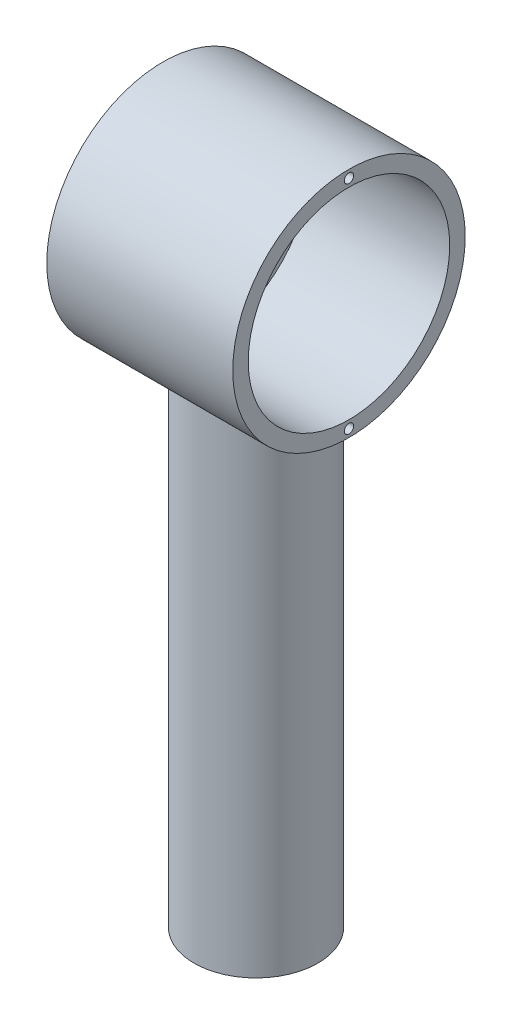
ISO-10303-21;
HEADER;
FILE_DESCRIPTION(('STEP AP214'),'2;1');
FILE_NAME('part.step','',(''),(''),'','','');
FILE_SCHEMA(('AUTOMOTIVE_DESIGN { 1 0 10303 214 1 1 1 1 }'));
ENDSEC;
DATA;
#1=APPLICATION_CONTEXT('core data for automotive mechanical design processes');
#2=APPLICATION_PROTOCOL_DEFINITION('international standard','automotive_design',2000,#1);
#3=PRODUCT_CONTEXT('',#1,'mechanical');
#4=PRODUCT('Part','Part','',(#3));
#5=PRODUCT_RELATED_PRODUCT_CATEGORY('part','',(#4));
#6=PRODUCT_DEFINITION_FORMATION('','',#4);
#7=PRODUCT_DEFINITION_CONTEXT('part definition',#1,'design');
#8=PRODUCT_DEFINITION('design','',#6,#7);
#9=PRODUCT_DEFINITION_SHAPE('','',#8);
#10=(LENGTH_UNIT() NAMED_UNIT(*) SI_UNIT(.MILLI.,.METRE.));
#11=(NAMED_UNIT(*) PLANE_ANGLE_UNIT() SI_UNIT($,.RADIAN.));
#12=(NAMED_UNIT(*) SI_UNIT($,.STERADIAN.) SOLID_ANGLE_UNIT());
#13=UNCERTAINTY_MEASURE_WITH_UNIT(LENGTH_MEASURE(1.E-05),#10,'distance_accuracy_value','');
#14=(GEOMETRIC_REPRESENTATION_CONTEXT(3) GLOBAL_UNCERTAINTY_ASSIGNED_CONTEXT((#13)) GLOBAL_UNIT_ASSIGNED_CONTEXT((#10,
#11,#12)) REPRESENTATION_CONTEXT('',''));
#15=CARTESIAN_POINT('',(0.,0.,0.));
#16=DIRECTION('',(0.,0.,1.));
#17=DIRECTION('',(1.,0.,0.));
#18=AXIS2_PLACEMENT_3D('',#15,#16,#17);
#19=CARTESIAN_POINT('',(30.,39.3347293897193,0.));
#20=DIRECTION('',(-1.,0.,0.));
#21=DIRECTION('',(0.,0.,1.));
#22=AXIS2_PLACEMENT_3D('',#19,#20,#21);
#23=CYLINDRICAL_SURFACE('',#22,37.5);
#24=CARTESIAN_POINT('',(0.,7.61328553859548,-20.));
#25=CARTESIAN_POINT('',(-0.51570182078703,7.6132880699644,-20.0000020694901));
#26=CARTESIAN_POINT('',(-1.03138048086282,7.60066823523603,-19.9800293716016));
#27=CARTESIAN_POINT('',(-2.05864988227541,7.55069636760927,-19.900438433849));
#28=CARTESIAN_POINT('',(-2.57023901293608,7.51333503324412,-19.8408052837619));
#29=CARTESIAN_POINT('',(-3.58588736208425,7.4152585886438,-19.6826321785822));
#30=CARTESIAN_POINT('',(-4.08993349078951,7.35450688776835,-19.5840312579613));
#31=CARTESIAN_POINT('',(-5.08606982289711,7.2119173548362,-19.3492573673804));
#32=CARTESIAN_POINT('',(-5.57816083404603,7.13008095172584,-19.2130869435256));
#33=CARTESIAN_POINT('',(-6.54451950031659,6.94867128669877,-18.9056831081237));
#34=CARTESIAN_POINT('',(-7.01887598033731,6.84920676482473,-18.7346637469901));
#35=CARTESIAN_POINT('',(-7.95042793399519,6.63528396459707,-18.3587310871486));
#36=CARTESIAN_POINT('',(-8.40762317654205,6.52082548443047,-18.1538173322254));
#37=CARTESIAN_POINT('',(-9.30288077314572,6.280113119196,-17.7117378683888));
#38=CARTESIAN_POINT('',(-9.7409430177589,6.15385916666921,-17.4745719750203));
#39=CARTESIAN_POINT('',(-10.5963194801134,5.89274883388715,-16.9695240952738));
#40=CARTESIAN_POINT('',(-11.0136317584403,5.75789165220258,-16.7016392454284));
#41=CARTESIAN_POINT('',(-11.8645739174769,5.46965896243555,-16.1097902433487));
#42=CARTESIAN_POINT('',(-12.2959988155331,5.31574005112918,-15.7829171398827));
#43=CARTESIAN_POINT('',(-13.1302687696288,5.00538236736176,-15.0959577863311));
#44=CARTESIAN_POINT('',(-13.5331236847503,4.84894448725216,-14.7358830932635));
#45=CARTESIAN_POINT('',(-14.3089302194614,4.53718321222723,-13.983797171619));
#46=CARTESIAN_POINT('',(-14.6818598793333,4.38186071053715,-13.5917629081743));
#47=CARTESIAN_POINT('',(-15.3955976257313,4.07610720045685,-12.7776616216099));
#48=CARTESIAN_POINT('',(-15.7364045621611,3.9256763673302,-12.3555935241317));
#49=CARTESIAN_POINT('',(-16.4096071243127,3.62159504628239,-11.4485193546584));
#50=CARTESIAN_POINT('',(-16.7391795739264,3.46863951891845,-10.9611773223788));
#51=CARTESIAN_POINT('',(-17.3557414498559,3.17677022398932,-9.95619250224608));
#52=CARTESIAN_POINT('',(-17.6427280097321,3.03785740183352,-9.43854767799109));
#53=CARTESIAN_POINT('',(-18.1710455089747,2.77814316417008,-8.37643552854965));
#54=CARTESIAN_POINT('',(-18.41240146501,2.65733183222565,-7.83198310803149));
#55=CARTESIAN_POINT('',(-18.8467311540172,2.43738288695592,-6.71989087808538));
#56=CARTESIAN_POINT('',(-19.0397108691608,2.33824259399959,-6.15225394574328));
#57=CARTESIAN_POINT('',(-19.3613843695543,2.17163162893653,-5.04409084493633));
#58=CARTESIAN_POINT('',(-19.4939561926983,2.10227597479069,-4.50497266267378));
#59=CARTESIAN_POINT('',(-19.7140932565086,1.98654763965169,-3.41518253756319));
#60=CARTESIAN_POINT('',(-19.8016606717114,1.9401738482179,-2.86451115428459));
#61=CARTESIAN_POINT('',(-19.9305089797469,1.87178493678521,-1.75660288316389));
#62=CARTESIAN_POINT('',(-19.9718172176824,1.84975542629783,-1.19937007105454));
#63=CARTESIAN_POINT('',(-20.0076218669366,1.83066715768317,-0.0829912230449223));
#64=CARTESIAN_POINT('',(-20.0021216831258,1.83360658330163,0.476154670739197));
#65=CARTESIAN_POINT('',(-19.9472644127489,1.86283417630171,1.53619969533));
#66=CARTESIAN_POINT('',(-19.9022922570022,1.88678776447231,2.03739765283052));
#67=CARTESIAN_POINT('',(-19.7749621587987,1.95430394753898,3.03364583244079));
#68=CARTESIAN_POINT('',(-19.6926072248326,1.99786496446631,3.52869654597525));
#69=CARTESIAN_POINT('',(-19.4914513891179,2.10356816382798,4.50931008296979));
#70=CARTESIAN_POINT('',(-19.3726492483943,2.16571097792434,4.99487258329354));
#71=CARTESIAN_POINT('',(-19.0998645810979,2.30715542449527,5.95344599270102));
#72=CARTESIAN_POINT('',(-18.9458807186661,2.38645770851321,6.42645642441812));
#73=CARTESIAN_POINT('',(-18.6021940192179,2.56151225269992,7.36274655171216));
#74=CARTESIAN_POINT('',(-18.4120876761664,2.65744915384273,7.82584330093237));
#75=CARTESIAN_POINT('',(-17.9990703595971,2.86303540513644,8.73397464778428));
#76=CARTESIAN_POINT('',(-17.7761594997008,2.97268470779299,9.17900930796887));
#77=CARTESIAN_POINT('',(-17.2992035665849,3.20345648806732,10.0490666696836));
#78=CARTESIAN_POINT('',(-17.0451518693495,3.32458140543233,10.4740850868216));
#79=CARTESIAN_POINT('',(-16.5076300698118,3.57587866384264,11.3022971689998));
#80=CARTESIAN_POINT('',(-16.2241573265239,3.70605181675742,11.7054888698094));
#81=CARTESIAN_POINT('',(-15.5985893577811,3.98674568958366,12.5291017597988));
#82=CARTESIAN_POINT('',(-15.2534633423082,4.13797742844741,12.9469820282129));
#83=CARTESIAN_POINT('',(-14.5313798049263,4.44484295747273,13.7525145719855));
#84=CARTESIAN_POINT('',(-14.1544203560153,4.60047701374398,14.1401650146785));
#85=CARTESIAN_POINT('',(-13.3701405977241,4.91262663007434,14.8839378037101));
#86=CARTESIAN_POINT('',(-12.9627935496855,5.06914285172146,15.2400317655331));
#87=CARTESIAN_POINT('',(-12.3307195861961,5.30153569487148,15.7488582454633));
#88=CARTESIAN_POINT('',(-12.116510807287,5.37860595092003,15.9142538119811));
#89=CARTESIAN_POINT('',(-11.681195108966,5.53149327670738,16.2364723560311));
#90=CARTESIAN_POINT('',(-11.460086037774,5.60730994402196,16.3932926166317));
#91=CARTESIAN_POINT('',(-10.7512386458969,5.84397514109671,16.8746465090342));
#92=CARTESIAN_POINT('',(-10.2513083612089,6.00159901702219,17.1830498160679));
#93=CARTESIAN_POINT('',(-9.22309815410546,6.30331720299424,17.7561472395889));
#94=CARTESIAN_POINT('',(-8.69482088095189,6.44741277392444,18.0208454312885));
#95=CARTESIAN_POINT('',(-7.88366626468449,6.64935618490528,18.3830210735658));
#96=CARTESIAN_POINT('',(-7.61021828324999,6.71429172444382,18.497913664606));
#97=CARTESIAN_POINT('',(-7.05750140500056,6.83879429917899,18.715766604051));
#98=CARTESIAN_POINT('',(-6.77823400271512,6.89836269233171,18.8187299725957));
#99=CARTESIAN_POINT('',(-5.93231320321243,7.0680650478359,19.1092351768966));
#100=CARTESIAN_POINT('',(-5.35737558916738,7.16923807530391,19.2784662419717));
#101=CARTESIAN_POINT('',(-4.23790937229369,7.33584327360834,19.553644852043));
#102=CARTESIAN_POINT('',(-3.69469269630252,7.40350754882363,19.6636096891331));
#103=CARTESIAN_POINT('',(-2.59831392694322,7.51172052869058,19.8382645405692));
#104=CARTESIAN_POINT('',(-2.04515244738685,7.55227090100259,19.9029573394163));
#105=CARTESIAN_POINT('',(-0.934456021777517,7.60436975146174,19.985912455731));
#106=CARTESIAN_POINT('',(-0.376925082364807,7.61594224913097,20.0042132273243));
#107=CARTESIAN_POINT('',(0.737521490785031,7.60960405604995,19.9941613677195));
#108=CARTESIAN_POINT('',(1.29443717682133,7.59169610124954,19.9658130658148));
#109=CARTESIAN_POINT('',(2.32861782358089,7.53154939769093,19.8698354015943));
#110=CARTESIAN_POINT('',(2.80663609459942,7.49285872051378,19.807924313161));
#111=CARTESIAN_POINT('',(3.75490327816776,7.39530343572092,19.6502332853426));
#112=CARTESIAN_POINT('',(4.22515302415459,7.33644100713542,19.5544570041705));
#113=CARTESIAN_POINT('',(5.15517852611524,7.20041592332948,19.3301078005834));
#114=CARTESIAN_POINT('',(5.6149510025583,7.12324762206767,19.201524758723));
#115=CARTESIAN_POINT('',(6.52146009102425,6.95292610209488,18.9128757451853));
#116=CARTESIAN_POINT('',(6.9681958338559,6.85977182039513,18.7528076798059));
#117=CARTESIAN_POINT('',(7.86590665438222,6.65563689578103,18.394868382629));
#118=CARTESIAN_POINT('',(8.31620402945305,6.54405241736956,18.1956441409796));
#119=CARTESIAN_POINT('',(9.19863635779434,6.30922572449742,17.7658681503462));
#120=CARTESIAN_POINT('',(9.63076356428131,6.18597860906466,17.5353032131866));
#121=CARTESIAN_POINT('',(10.4751592846687,5.9308834237878,17.0443420482752));
#122=CARTESIAN_POINT('',(10.8874241815632,5.79903379760681,16.7839404160909));
#123=CARTESIAN_POINT('',(11.6906450394737,5.52972993234768,16.234702654998));
#124=CARTESIAN_POINT('',(12.0815992232859,5.39227522750069,15.9458641602208));
#125=CARTESIAN_POINT('',(12.8968327162095,5.09419926730205,15.2964635816017));
#126=CARTESIAN_POINT('',(13.3175400727492,4.93314757086699,14.931603315024));
#127=CARTESIAN_POINT('',(14.1272437684801,4.61166900271007,14.167947195493));
#128=CARTESIAN_POINT('',(14.5162373768361,4.45124218592611,13.7691484261636));
#129=CARTESIAN_POINT('',(15.260632807053,4.13496611295089,12.9392398085584));
#130=CARTESIAN_POINT('',(15.6160178550132,3.97911916902201,12.5081140164347));
#131=CARTESIAN_POINT('',(16.2907536419708,3.67596031043994,11.6156902573406));
#132=CARTESIAN_POINT('',(16.610104394801,3.52864839251033,11.154392301953));
#133=CARTESIAN_POINT('',(17.2229254898073,3.24036680527126,10.183991767619));
#134=CARTESIAN_POINT('',(17.514759715978,3.09991832994598,9.67369760070825));
#135=CARTESIAN_POINT('',(18.0538993037871,2.83626399048115,8.62576948259296));
#136=CARTESIAN_POINT('',(18.3012025928681,2.71305892894344,8.08813426037458));
#137=CARTESIAN_POINT('',(18.7482234390732,2.48763118452518,6.98966501489584));
#138=CARTESIAN_POINT('',(18.9479790657331,2.38539172446142,6.42884997594815));
#139=CARTESIAN_POINT('',(19.297455902112,2.20496544127273,5.28809092848529));
#140=CARTESIAN_POINT('',(19.4471840388594,2.12677528829321,4.70814958051198));
#141=CARTESIAN_POINT('',(19.6821437839116,2.00340406914947,3.59240502635107));
#142=CARTESIAN_POINT('',(19.772289467478,1.95572325345381,3.05790886541163));
#143=CARTESIAN_POINT('',(19.9089530850035,1.88325369864124,1.98183214986327));
#144=CARTESIAN_POINT('',(19.9554739590957,1.85846341679803,1.44025207517587));
#145=CARTESIAN_POINT('',(20.0042303784103,1.83247863443271,0.354749121186357));
#146=CARTESIAN_POINT('',(20.0064830368679,1.83127501576367,-0.189172771475614));
#147=CARTESIAN_POINT('',(19.9667133892609,1.85247557522932,-1.27491994456974));
#148=CARTESIAN_POINT('',(19.924692919087,1.87487877445111,-1.81674531100427));
#149=CARTESIAN_POINT('',(19.8021741343333,1.93989452502643,-2.84994112337194));
#150=CARTESIAN_POINT('',(19.7250802887853,1.98071677905486,-3.34183352060926));
#151=CARTESIAN_POINT('',(19.5349170787364,2.08078402472055,-4.31666546450881));
#152=CARTESIAN_POINT('',(19.4218501893373,2.14002774887424,-4.79960562470527));
#153=CARTESIAN_POINT('',(19.1609304561323,2.2756030999327,-5.75354734954822));
#154=CARTESIAN_POINT('',(19.013075402407,2.35193581240119,-6.22454815364019));
#155=CARTESIAN_POINT('',(18.6840113486702,2.52002741658279,-7.15191066342813));
#156=CARTESIAN_POINT('',(18.5028007591816,2.61178704341008,-7.60827167028258));
#157=CARTESIAN_POINT('',(18.1011724085677,2.81252984845167,-8.52087859171125));
#158=CARTESIAN_POINT('',(17.8795354415977,2.9220313921495,-8.97647337098125));
#159=CARTESIAN_POINT('',(17.4038544118732,3.1532292750963,-9.86715686443598));
#160=CARTESIAN_POINT('',(17.1498098908654,3.27492578678086,-10.302245288535));
#161=CARTESIAN_POINT('',(16.6110188950497,3.52803481329824,-11.1501774118709));
#162=CARTESIAN_POINT('',(16.326263208179,3.65945023966245,-11.5630143806002));
#163=CARTESIAN_POINT('',(15.7278002398746,3.92932914281693,-12.364731365233));
#164=CARTESIAN_POINT('',(15.4140900152394,4.06779333546474,-12.7536089389721));
#165=CARTESIAN_POINT('',(14.7231741657298,4.36454119290665,-13.5475000625257));
#166=CARTESIAN_POINT('',(14.3427819832896,4.52332570635551,-13.9495579337108));
#167=CARTESIAN_POINT('',(13.5503054853644,4.8422779960791,-14.7205601593971));
#168=CARTESIAN_POINT('',(13.1382187825437,5.00244587574532,-15.0895020149462));
#169=CARTESIAN_POINT('',(12.2838013095431,5.32025654018632,-15.7928698949614));
#170=CARTESIAN_POINT('',(11.8414372203949,5.47789629962482,-16.1272568440539));
#171=CARTESIAN_POINT('',(10.928825106116,5.78618549533389,-16.7591408544251));
#172=CARTESIAN_POINT('',(10.4585786781072,5.93683533111324,-17.0566400256525));
#173=CARTESIAN_POINT('',(9.4660459672117,6.23457796367636,-17.6277979510643));
#174=CARTESIAN_POINT('',(8.94232063328413,6.3810371109805,-17.8992953962635));
#175=CARTESIAN_POINT('',(7.86886091086252,6.65599199411329,-18.3964918948525));
#176=CARTESIAN_POINT('',(7.31912211873666,6.78448467386223,-18.6221831595937));
#177=CARTESIAN_POINT('',(6.19886278931986,7.01791071629903,-19.024384907481));
#178=CARTESIAN_POINT('',(5.62840595658142,7.12291019016861,-19.201033745358));
#179=CARTESIAN_POINT('',(4.47007390274586,7.30497875372796,-19.5032386917275));
#180=CARTESIAN_POINT('',(3.88221048468111,7.3820663210496,-19.6288286079236));
#181=CARTESIAN_POINT('',(2.7470780378961,7.49911189520011,-19.8180391560448));
#182=CARTESIAN_POINT('',(2.20083618219898,7.54175781178129,-19.8861700850289));
#183=CARTESIAN_POINT('',(1.10305418721149,7.59884381135044,-19.9771502535946));
#184=CARTESIAN_POINT('',(0.55151384904951,7.61328283143998,-19.9999977867977));
#185=CARTESIAN_POINT('',(0.,7.61328553859548,-20.));
#186=B_SPLINE_CURVE_WITH_KNOTS('',3,(#24,#25,#26,#27,#28,#29,#30,#31,#32,#33,#34,#35,#36,#37,
#38,#39,#40,#41,#42,#43,#44,#45,#46,#47,#48,#49,#50,#51,#52,#53,#54,#55,#56,#57,#58,#59,#60,#61,
#62,#63,#64,#65,#66,#67,#68,#69,#70,#71,#72,#73,#74,#75,#76,#77,#78,#79,#80,#81,#82,#83,#84,#85,
#86,#87,#88,#89,#90,#91,#92,#93,#94,#95,#96,#97,#98,#99,#100,#101,#102,#103,#104,#105,#106,#107,
#108,#109,#110,#111,#112,#113,#114,#115,#116,#117,#118,#119,#120,#121,#122,#123,#124,#125,#126,
#127,#128,#129,#130,#131,#132,#133,#134,#135,#136,#137,#138,#139,#140,#141,#142,#143,#144,#145,
#146,#147,#148,#149,#150,#151,#152,#153,#154,#155,#156,#157,#158,#159,#160,#161,#162,#163,#164,
#165,#166,#167,#168,#169,#170,#171,#172,#173,#174,#175,#176,#177,#178,#179,#180,#181,#182,#183,
#184,#185),.UNSPECIFIED.,.T.,.F.,(4,2,2,2,2,2,2,2,2,2,2,2,2,2,2,2,2,2,2,2,2,2,2,2,2,2,2,2,2,2,2,
2,2,2,2,2,2,2,2,2,2,2,2,2,2,2,2,2,2,2,2,2,2,2,2,2,2,2,2,2,2,2,2,2,2,2,2,2,2,2,2,2,2,2,2,2,2,2,2,
2,4),(0.,1.54653102412566,3.0936437906582,4.6431866763651,6.19262457451161,7.73281777044317,
9.27303169891885,10.8132544364963,12.3536208628203,14.040050545629,15.7258954056102,
17.4129662674639,19.1000975089252,20.9213689398888,22.7427629043674,24.5631553877423,
26.3833226515055,28.059489973695,29.7355762987162,31.4106713180379,33.0856444910623,
34.5951981761441,36.1046303969191,37.6141139345514,39.1236547971856,40.6511712473975,
42.1786824070403,43.7065190516389,45.2344929615787,46.9207293716491,48.6070679294707,
50.2949082420574,51.1388926875629,51.9831430032304,53.8052600800145,55.6272071603968,
56.5377943533881,57.448150505485,59.2683063920866,60.9409458022714,62.6134823260862,
64.2846320385256,65.9556266677268,67.4046488518205,68.853514556278,70.3028277136487,
71.7522372805584,73.2653941231695,74.7791896853173,76.2932598817077,77.8074561511926,
79.544658326591,81.2820099328677,83.0202241182139,84.7584376362927,86.5691871795349,
88.3800209768545,90.189399997079,91.9985283787263,93.628739619584,95.2588409829981,
96.8883121683758,98.5177157865105,100.014703624748,101.511588485983,103.008568462574,
104.505619792595,106.059030766784,107.612463709144,109.166363919111,110.720422255902,
112.445990412954,114.171688673013,115.899317510118,117.626847482728,119.447862072683,
121.269186039717,123.085318370938,124.900246218139,126.554111116078,128.208038334114),.UNSPECIFIED.);
#187=CARTESIAN_POINT('',(0.,7.61328553859548,-20.));
#188=VERTEX_POINT('',#187);
#189=EDGE_CURVE('E12',#188,#188,#186,.T.);
#190=ORIENTED_EDGE('',*,*,#189,.T.);
#191=EDGE_LOOP('',(#190));
#192=FACE_BOUND('',#191,.T.);
#193=CARTESIAN_POINT('',(-30.,39.3347293897193,0.));
#194=DIRECTION('',(1.,0.,0.));
#195=DIRECTION('',(0.,0.,-1.));
#196=AXIS2_PLACEMENT_3D('',#193,#194,#195);
#197=CIRCLE('',#196,37.5);
#198=CARTESIAN_POINT('',(-30.,39.3347293897193,-37.5));
#199=VERTEX_POINT('',#198);
#200=EDGE_CURVE('E119',#199,#199,#197,.T.);
#201=ORIENTED_EDGE('',*,*,#200,.T.);
#202=EDGE_LOOP('',(#201));
#203=FACE_BOUND('',#202,.T.);
#204=CARTESIAN_POINT('',(30.,39.3347293897193,0.));
#205=DIRECTION('',(1.,0.,0.));
#206=DIRECTION('',(0.,0.,-1.));
#207=AXIS2_PLACEMENT_3D('',#204,#205,#206);
#208=CIRCLE('',#207,37.5);
#209=CARTESIAN_POINT('',(30.,39.3347293897193,-37.5));
#210=VERTEX_POINT('',#209);
#211=EDGE_CURVE('E493',#210,#210,#208,.T.);
#212=ORIENTED_EDGE('',*,*,#211,.F.);
#213=EDGE_LOOP('',(#212));
#214=FACE_BOUND('',#213,.T.);
#215=ADVANCED_FACE('F49',(#192,#203,#214),#23,.T.);
#216=CARTESIAN_POINT('',(0.,25.,0.));
#217=DIRECTION('',(0.,-1.,0.));
#218=DIRECTION('',(0.,0.,-1.));
#219=AXIS2_PLACEMENT_3D('',#216,#217,#218);
#220=CYLINDRICAL_SURFACE('',#219,20.);
#221=CARTESIAN_POINT('',(0.,-150.,0.));
#222=DIRECTION('',(0.,-1.,0.));
#223=DIRECTION('',(0.,0.,-1.));
#224=AXIS2_PLACEMENT_3D('',#221,#222,#223);
#225=CIRCLE('',#224,20.);
#226=CARTESIAN_POINT('',(0.,-150.,-20.));
#227=VERTEX_POINT('',#226);
#228=EDGE_CURVE('E137',#227,#227,#225,.T.);
#229=ORIENTED_EDGE('',*,*,#228,.F.);
#230=EDGE_LOOP('',(#229));
#231=FACE_BOUND('',#230,.T.);
#232=ORIENTED_EDGE('',*,*,#189,.F.);
#233=EDGE_LOOP('',(#232));
#234=FACE_BOUND('',#233,.T.);
#235=ADVANCED_FACE('F51',(#231,#234),#220,.T.);
#236=CARTESIAN_POINT('',(12.5,-75.,0.));
#237=DIRECTION('',(1.,0.,0.));
#238=DIRECTION('',(0.,0.,-1.));
#239=AXIS2_PLACEMENT_3D('',#236,#237,#238);
#240=PLANE('',#239);
#241=DIRECTION('',(0.,-1.,0.));
#242=VECTOR('',#241,1.);
#243=CARTESIAN_POINT('',(12.5,-75.,-7.21687836487032));
#244=LINE('',#243,#242);
#245=CARTESIAN_POINT('',(12.5,-75.,-7.21687836487032));
#246=VERTEX_POINT('',#245);
#247=CARTESIAN_POINT('',(12.5,-150.,-7.2168783648703));
#248=VERTEX_POINT('',#247);
#249=EDGE_CURVE('E62',#246,#248,#244,.T.);
#250=ORIENTED_EDGE('',*,*,#249,.T.);
#251=DIRECTION('',(0.,0.,1.));
#252=VECTOR('',#251,1.);
#253=CARTESIAN_POINT('',(12.5,-150.,-7.2168783648703));
#254=LINE('',#253,#252);
#255=CARTESIAN_POINT('',(12.5,-150.,7.21687836487038));
#256=VERTEX_POINT('',#255);
#257=EDGE_CURVE('E124',#248,#256,#254,.T.);
#258=ORIENTED_EDGE('',*,*,#257,.T.);
#259=DIRECTION('',(0.,-1.,0.));
#260=VECTOR('',#259,1.);
#261=CARTESIAN_POINT('',(12.5,-75.,7.21687836487033));
#262=LINE('',#261,#260);
#263=CARTESIAN_POINT('',(12.5,-75.,7.21687836487033));
#264=VERTEX_POINT('',#263);
#265=EDGE_CURVE('E155',#264,#256,#262,.T.);
#266=ORIENTED_EDGE('',*,*,#265,.F.);
#267=DIRECTION('',(0.,0.,1.));
#268=VECTOR('',#267,1.);
#269=CARTESIAN_POINT('',(12.5,-75.,0.));
#270=LINE('',#269,#268);
#271=EDGE_CURVE('E140',#246,#264,#270,.T.);
#272=ORIENTED_EDGE('',*,*,#271,.F.);
#273=EDGE_LOOP('',(#250,#258,#266,#272));
#274=FACE_BOUND('',#273,.T.);
#275=ADVANCED_FACE('F166',(#274),#240,.F.);
#276=CARTESIAN_POINT('',(6.25,-75.,-10.8253175473055));
#277=DIRECTION('',(0.5,0.,-0.866025403784439));
#278=DIRECTION('',(-0.866025403784439,0.,-0.5));
#279=AXIS2_PLACEMENT_3D('',#276,#277,#278);
#280=PLANE('',#279);
#281=DIRECTION('',(0.,-1.,0.));
#282=VECTOR('',#281,1.);
#283=CARTESIAN_POINT('',(0.,-75.,-14.4337567297407));
#284=LINE('',#283,#282);
#285=CARTESIAN_POINT('',(0.,-75.,-14.4337567297407));
#286=VERTEX_POINT('',#285);
#287=CARTESIAN_POINT('',(0.,-150.,-14.4337567297407));
#288=VERTEX_POINT('',#287);
#289=EDGE_CURVE('E76',#286,#288,#284,.T.);
#290=ORIENTED_EDGE('',*,*,#289,.T.);
#291=DIRECTION('',(0.866025403784438,0.,0.500000000000001));
#292=VECTOR('',#291,1.);
#293=CARTESIAN_POINT('',(0.,-150.,-14.4337567297407));
#294=LINE('',#293,#292);
#295=EDGE_CURVE('E107',#288,#248,#294,.T.);
#296=ORIENTED_EDGE('',*,*,#295,.T.);
#297=ORIENTED_EDGE('',*,*,#249,.F.);
#298=DIRECTION('',(0.866025403784439,0.,0.5));
#299=VECTOR('',#298,1.);
#300=CARTESIAN_POINT('',(6.25,-75.,-10.8253175473055));
#301=LINE('',#300,#299);
#302=EDGE_CURVE('E110',#286,#246,#301,.T.);
#303=ORIENTED_EDGE('',*,*,#302,.F.);
#304=EDGE_LOOP('',(#290,#296,#297,#303));
#305=FACE_BOUND('',#304,.T.);
#306=ADVANCED_FACE('F105',(#305),#280,.F.);
#307=CARTESIAN_POINT('',(-6.25000000000001,-75.,-10.8253175473055));
#308=DIRECTION('',(-0.5,0.,-0.866025403784438));
#309=DIRECTION('',(-0.866025403784439,0.,0.5));
#310=AXIS2_PLACEMENT_3D('',#307,#308,#309);
#311=PLANE('',#310);
#312=DIRECTION('',(0.,-1.,0.));
#313=VECTOR('',#312,1.);
#314=CARTESIAN_POINT('',(-12.5,-75.,-7.21687836487032));
#315=LINE('',#314,#313);
#316=CARTESIAN_POINT('',(-12.5,-75.,-7.21687836487032));
#317=VERTEX_POINT('',#316);
#318=CARTESIAN_POINT('',(-12.4999999999999,-150.,-7.21687836487047));
#319=VERTEX_POINT('',#318);
#320=EDGE_CURVE('E111',#317,#319,#315,.T.);
#321=ORIENTED_EDGE('',*,*,#320,.T.);
#322=DIRECTION('',(0.866025403784441,0.,-0.499999999999995));
#323=VECTOR('',#322,1.);
#324=CARTESIAN_POINT('',(-12.4999999999999,-150.,-7.21687836487047));
#325=LINE('',#324,#323);
#326=EDGE_CURVE('E114',#319,#288,#325,.T.);
#327=ORIENTED_EDGE('',*,*,#326,.T.);
#328=ORIENTED_EDGE('',*,*,#289,.F.);
#329=DIRECTION('',(0.866025403784439,0.,-0.5));
#330=VECTOR('',#329,1.);
#331=CARTESIAN_POINT('',(-6.25000000000001,-75.,-10.8253175473055));
#332=LINE('',#331,#330);
#333=EDGE_CURVE('E152',#317,#286,#332,.T.);
#334=ORIENTED_EDGE('',*,*,#333,.F.);
#335=EDGE_LOOP('',(#321,#327,#328,#334));
#336=FACE_BOUND('',#335,.T.);
#337=ADVANCED_FACE('F115',(#336),#311,.F.);
#338=CARTESIAN_POINT('',(-12.5,-75.,0.));
#339=DIRECTION('',(-1.,0.,0.));
#340=DIRECTION('',(0.,0.,1.));
#341=AXIS2_PLACEMENT_3D('',#338,#339,#340);
#342=PLANE('',#341);
#343=DIRECTION('',(0.,-1.,0.));
#344=VECTOR('',#343,1.);
#345=CARTESIAN_POINT('',(-12.5,-75.,7.21687836487033));
#346=LINE('',#345,#344);
#347=CARTESIAN_POINT('',(-12.5,-75.,7.21687836487033));
#348=VERTEX_POINT('',#347);
#349=CARTESIAN_POINT('',(-12.5000000000001,-150.,7.21687836487021));
#350=VERTEX_POINT('',#349);
#351=EDGE_CURVE('E158',#348,#350,#346,.T.);
#352=ORIENTED_EDGE('',*,*,#351,.T.);
#353=DIRECTION('',(0.,0.,-1.));
#354=VECTOR('',#353,1.);
#355=CARTESIAN_POINT('',(-12.5000000000001,-150.,7.21687836487021));
#356=LINE('',#355,#354);
#357=EDGE_CURVE('E135',#350,#319,#356,.T.);
#358=ORIENTED_EDGE('',*,*,#357,.T.);
#359=ORIENTED_EDGE('',*,*,#320,.F.);
#360=DIRECTION('',(0.,0.,-1.));
#361=VECTOR('',#360,1.);
#362=CARTESIAN_POINT('',(-12.5,-75.,0.));
#363=LINE('',#362,#361);
#364=EDGE_CURVE('E149',#348,#317,#363,.T.);
#365=ORIENTED_EDGE('',*,*,#364,.F.);
#366=EDGE_LOOP('',(#352,#358,#359,#365));
#367=FACE_BOUND('',#366,.T.);
#368=ADVANCED_FACE('F174',(#367),#342,.F.);
#369=CARTESIAN_POINT('',(-6.25,-75.,10.8253175473055));
#370=DIRECTION('',(-0.5,0.,0.866025403784439));
#371=DIRECTION('',(0.866025403784439,0.,0.5));
#372=AXIS2_PLACEMENT_3D('',#369,#370,#371);
#373=PLANE('',#372);
#374=DIRECTION('',(0.,-1.,0.));
#375=VECTOR('',#374,1.);
#376=CARTESIAN_POINT('',(0.,-75.,14.4337567297406));
#377=LINE('',#376,#375);
#378=CARTESIAN_POINT('',(0.,-75.,14.4337567297406));
#379=VERTEX_POINT('',#378);
#380=CARTESIAN_POINT('',(0.,-150.,14.4337567297407));
#381=VERTEX_POINT('',#380);
#382=EDGE_CURVE('E160',#379,#381,#377,.T.);
#383=ORIENTED_EDGE('',*,*,#382,.T.);
#384=DIRECTION('',(-0.866025403784435,0.,-0.500000000000007));
#385=VECTOR('',#384,1.);
#386=CARTESIAN_POINT('',(0.,-150.,14.4337567297407));
#387=LINE('',#386,#385);
#388=EDGE_CURVE('E132',#381,#350,#387,.T.);
#389=ORIENTED_EDGE('',*,*,#388,.T.);
#390=ORIENTED_EDGE('',*,*,#351,.F.);
#391=DIRECTION('',(-0.866025403784439,0.,-0.5));
#392=VECTOR('',#391,1.);
#393=CARTESIAN_POINT('',(-6.25,-75.,10.8253175473055));
#394=LINE('',#393,#392);
#395=EDGE_CURVE('E146',#379,#348,#394,.T.);
#396=ORIENTED_EDGE('',*,*,#395,.F.);
#397=EDGE_LOOP('',(#383,#389,#390,#396));
#398=FACE_BOUND('',#397,.T.);
#399=ADVANCED_FACE('F168',(#398),#373,.F.);
#400=CARTESIAN_POINT('',(6.25000000000001,-75.,10.8253175473055));
#401=DIRECTION('',(0.5,0.,0.866025403784439));
#402=DIRECTION('',(0.866025403784439,0.,-0.5));
#403=AXIS2_PLACEMENT_3D('',#400,#401,#402);
#404=PLANE('',#403);
#405=ORIENTED_EDGE('',*,*,#265,.T.);
#406=DIRECTION('',(-0.866025403784441,0.,0.499999999999995));
#407=VECTOR('',#406,1.);
#408=CARTESIAN_POINT('',(12.5,-150.,7.21687836487038));
#409=LINE('',#408,#407);
#410=EDGE_CURVE('E126',#256,#381,#409,.T.);
#411=ORIENTED_EDGE('',*,*,#410,.T.);
#412=ORIENTED_EDGE('',*,*,#382,.F.);
#413=DIRECTION('',(-0.866025403784439,0.,0.5));
#414=VECTOR('',#413,1.);
#415=CARTESIAN_POINT('',(6.25000000000001,-75.,10.8253175473055));
#416=LINE('',#415,#414);
#417=EDGE_CURVE('E143',#264,#379,#416,.T.);
#418=ORIENTED_EDGE('',*,*,#417,.F.);
#419=EDGE_LOOP('',(#405,#411,#412,#418));
#420=FACE_BOUND('',#419,.T.);
#421=ADVANCED_FACE('F163',(#420),#404,.F.);
#422=CARTESIAN_POINT('',(0.,-75.,0.));
#423=DIRECTION('',(0.,-1.,0.));
#424=DIRECTION('',(0.,0.,-1.));
#425=AXIS2_PLACEMENT_3D('',#422,#423,#424);
#426=PLANE('',#425);
#427=ORIENTED_EDGE('',*,*,#271,.T.);
#428=ORIENTED_EDGE('',*,*,#417,.T.);
#429=ORIENTED_EDGE('',*,*,#395,.T.);
#430=ORIENTED_EDGE('',*,*,#364,.T.);
#431=ORIENTED_EDGE('',*,*,#333,.T.);
#432=ORIENTED_EDGE('',*,*,#302,.T.);
#433=EDGE_LOOP('',(#427,#428,#429,#430,#431,#432));
#434=FACE_BOUND('',#433,.T.);
#435=ADVANCED_FACE('F172',(#434),#426,.T.);
#436=CARTESIAN_POINT('',(0.,-150.,0.));
#437=DIRECTION('',(0.,-1.,0.));
#438=DIRECTION('',(0.,0.,-1.));
#439=AXIS2_PLACEMENT_3D('',#436,#437,#438);
#440=PLANE('',#439);
#441=ORIENTED_EDGE('',*,*,#228,.T.);
#442=EDGE_LOOP('',(#441));
#443=FACE_BOUND('',#442,.T.);
#444=ORIENTED_EDGE('',*,*,#295,.F.);
#445=ORIENTED_EDGE('',*,*,#326,.F.);
#446=ORIENTED_EDGE('',*,*,#357,.F.);
#447=ORIENTED_EDGE('',*,*,#388,.F.);
#448=ORIENTED_EDGE('',*,*,#410,.F.);
#449=ORIENTED_EDGE('',*,*,#257,.F.);
#450=EDGE_LOOP('',(#444,#445,#446,#447,#448,#449));
#451=FACE_BOUND('',#450,.T.);
#452=ADVANCED_FACE('F121',(#443,#451),#440,.T.);
#453=CARTESIAN_POINT('',(-30.,39.3347293897193,0.));
#454=DIRECTION('',(1.,0.,0.));
#455=DIRECTION('',(0.,0.,-1.));
#456=AXIS2_PLACEMENT_3D('',#453,#454,#455);
#457=PLANE('',#456);
#458=ORIENTED_EDGE('',*,*,#200,.F.);
#459=EDGE_LOOP('',(#458));
#460=FACE_BOUND('',#459,.T.);
#461=ADVANCED_FACE('F193',(#460),#457,.F.);
#462=CARTESIAN_POINT('',(30.,39.3347293897193,0.));
#463=DIRECTION('',(1.,0.,0.));
#464=DIRECTION('',(0.,0.,-1.));
#465=AXIS2_PLACEMENT_3D('',#462,#463,#464);
#466=PLANE('',#465);
#467=CARTESIAN_POINT('',(30.,74.3347293897193,0.));
#468=DIRECTION('',(1.,0.,0.));
#469=DIRECTION('',(0.,0.,-1.));
#470=AXIS2_PLACEMENT_3D('',#467,#468,#469);
#471=CIRCLE('',#470,1.5);
#472=CARTESIAN_POINT('',(30.,74.3347293897193,-1.5));
#473=VERTEX_POINT('',#472);
#474=EDGE_CURVE('E483',#473,#473,#471,.T.);
#475=ORIENTED_EDGE('',*,*,#474,.F.);
#476=EDGE_LOOP('',(#475));
#477=FACE_BOUND('',#476,.T.);
#478=CARTESIAN_POINT('',(30.,4.33472938971928,0.));
#479=DIRECTION('',(1.,0.,0.));
#480=DIRECTION('',(0.,0.,-1.));
#481=AXIS2_PLACEMENT_3D('',#478,#479,#480);
#482=CIRCLE('',#481,1.5);
#483=CARTESIAN_POINT('',(30.,4.33472938971928,-1.5));
#484=VERTEX_POINT('',#483);
#485=EDGE_CURVE('E486',#484,#484,#482,.T.);
#486=ORIENTED_EDGE('',*,*,#485,.F.);
#487=EDGE_LOOP('',(#486));
#488=FACE_BOUND('',#487,.T.);
#489=CARTESIAN_POINT('',(30.,39.3347293897193,0.));
#490=DIRECTION('',(1.,0.,0.));
#491=DIRECTION('',(0.,0.,-1.));
#492=AXIS2_PLACEMENT_3D('',#489,#490,#491);
#493=CIRCLE('',#492,32.5);
#494=CARTESIAN_POINT('',(30.,39.3347293897193,-32.5));
#495=VERTEX_POINT('',#494);
#496=EDGE_CURVE('E482',#495,#495,#493,.T.);
#497=ORIENTED_EDGE('',*,*,#496,.F.);
#498=EDGE_LOOP('',(#497));
#499=FACE_BOUND('',#498,.T.);
#500=ORIENTED_EDGE('',*,*,#211,.T.);
#501=EDGE_LOOP('',(#500));
#502=FACE_BOUND('',#501,.T.);
#503=ADVANCED_FACE('F227',(#477,#488,#499,#502),#466,.T.);
#504=CARTESIAN_POINT('',(-20.,39.3347293897193,0.));
#505=DIRECTION('',(1.,0.,0.));
#506=DIRECTION('',(0.,0.,-1.));
#507=AXIS2_PLACEMENT_3D('',#504,#505,#506);
#508=CYLINDRICAL_SURFACE('',#507,32.5);
#509=CARTESIAN_POINT('',(-15.,39.3347293897193,0.));
#510=DIRECTION('',(1.,0.,0.));
#511=DIRECTION('',(0.,0.,-1.));
#512=AXIS2_PLACEMENT_3D('',#509,#510,#511);
#513=CIRCLE('',#512,32.5);
#514=CARTESIAN_POINT('',(-15.,39.3347293897193,-32.5));
#515=VERTEX_POINT('',#514);
#516=EDGE_CURVE('E473',#515,#515,#513,.T.);
#517=ORIENTED_EDGE('',*,*,#516,.F.);
#518=EDGE_LOOP('',(#517));
#519=FACE_BOUND('',#518,.T.);
#520=ORIENTED_EDGE('',*,*,#496,.T.);
#521=EDGE_LOOP('',(#520));
#522=FACE_BOUND('',#521,.T.);
#523=ADVANCED_FACE('F234',(#519,#522),#508,.F.);
#524=CARTESIAN_POINT('',(20.,4.33472938971928,0.));
#525=DIRECTION('',(1.,0.,0.));
#526=DIRECTION('',(0.,0.,-1.));
#527=AXIS2_PLACEMENT_3D('',#524,#525,#526);
#528=CYLINDRICAL_SURFACE('',#527,1.5);
#529=CARTESIAN_POINT('',(20.,4.33472938971928,0.));
#530=DIRECTION('',(1.,0.,0.));
#531=DIRECTION('',(0.,0.,-1.));
#532=AXIS2_PLACEMENT_3D('',#529,#530,#531);
#533=CIRCLE('',#532,1.5);
#534=CARTESIAN_POINT('',(20.,4.33472938971928,-1.5));
#535=VERTEX_POINT('',#534);
#536=EDGE_CURVE('E478',#535,#535,#533,.T.);
#537=ORIENTED_EDGE('',*,*,#536,.F.);
#538=EDGE_LOOP('',(#537));
#539=FACE_BOUND('',#538,.T.);
#540=ORIENTED_EDGE('',*,*,#485,.T.);
#541=EDGE_LOOP('',(#540));
#542=FACE_BOUND('',#541,.T.);
#543=ADVANCED_FACE('F243',(#539,#542),#528,.F.);
#544=CARTESIAN_POINT('',(20.,4.33472938971928,0.));
#545=DIRECTION('',(1.,0.,0.));
#546=DIRECTION('',(0.,0.,-1.));
#547=AXIS2_PLACEMENT_3D('',#544,#545,#546);
#548=PLANE('',#547);
#549=ORIENTED_EDGE('',*,*,#536,.T.);
#550=EDGE_LOOP('',(#549));
#551=FACE_BOUND('',#550,.T.);
#552=ADVANCED_FACE('F251',(#551),#548,.T.);
#553=CARTESIAN_POINT('',(20.,74.3347293897193,0.));
#554=DIRECTION('',(1.,0.,0.));
#555=DIRECTION('',(0.,0.,-1.));
#556=AXIS2_PLACEMENT_3D('',#553,#554,#555);
#557=CYLINDRICAL_SURFACE('',#556,1.5);
#558=CARTESIAN_POINT('',(20.,74.3347293897193,0.));
#559=DIRECTION('',(1.,0.,0.));
#560=DIRECTION('',(0.,0.,-1.));
#561=AXIS2_PLACEMENT_3D('',#558,#559,#560);
#562=CIRCLE('',#561,1.5);
#563=CARTESIAN_POINT('',(20.,74.3347293897193,-1.5));
#564=VERTEX_POINT('',#563);
#565=EDGE_CURVE('E479',#564,#564,#562,.T.);
#566=ORIENTED_EDGE('',*,*,#565,.F.);
#567=EDGE_LOOP('',(#566));
#568=FACE_BOUND('',#567,.T.);
#569=ORIENTED_EDGE('',*,*,#474,.T.);
#570=EDGE_LOOP('',(#569));
#571=FACE_BOUND('',#570,.T.);
#572=ADVANCED_FACE('F259',(#568,#571),#557,.F.);
#573=CARTESIAN_POINT('',(20.,74.3347293897193,0.));
#574=DIRECTION('',(1.,0.,0.));
#575=DIRECTION('',(0.,0.,-1.));
#576=AXIS2_PLACEMENT_3D('',#573,#574,#575);
#577=PLANE('',#576);
#578=ORIENTED_EDGE('',*,*,#565,.T.);
#579=EDGE_LOOP('',(#578));
#580=FACE_BOUND('',#579,.T.);
#581=ADVANCED_FACE('F267',(#580),#577,.T.);
#582=CARTESIAN_POINT('',(-15.,39.3347293897193,0.));
#583=DIRECTION('',(1.,0.,0.));
#584=DIRECTION('',(0.,0.,-1.));
#585=AXIS2_PLACEMENT_3D('',#582,#583,#584);
#586=PLANE('',#585);
#587=CARTESIAN_POINT('',(-15.,64.4692730849174,7.975));
#588=DIRECTION('',(1.,0.,0.));
#589=DIRECTION('',(0.,0.,-1.));
#590=AXIS2_PLACEMENT_3D('',#587,#588,#589);
#591=CIRCLE('',#590,1.);
#592=CARTESIAN_POINT('',(-15.,64.4692730849174,6.975));
#593=VERTEX_POINT('',#592);
#594=EDGE_CURVE('E470',#593,#593,#591,.T.);
#595=ORIENTED_EDGE('',*,*,#594,.F.);
#596=EDGE_LOOP('',(#595));
#597=FACE_BOUND('',#596,.T.);
#598=CARTESIAN_POINT('',(-15.,64.4692730849174,-7.975));
#599=DIRECTION('',(1.,0.,0.));
#600=DIRECTION('',(0.,0.,-1.));
#601=AXIS2_PLACEMENT_3D('',#598,#599,#600);
#602=CIRCLE('',#601,1.);
#603=CARTESIAN_POINT('',(-15.,64.4692730849174,-8.975));
#604=VERTEX_POINT('',#603);
#605=EDGE_CURVE('E467',#604,#604,#602,.T.);
#606=ORIENTED_EDGE('',*,*,#605,.F.);
#607=EDGE_LOOP('',(#606));
#608=FACE_BOUND('',#607,.T.);
#609=ORIENTED_EDGE('',*,*,#516,.T.);
#610=EDGE_LOOP('',(#609));
#611=FACE_BOUND('',#610,.T.);
#612=ADVANCED_FACE('F274',(#597,#608,#611),#586,.T.);
#613=CARTESIAN_POINT('',(-20.,64.4692730849174,-7.975));
#614=DIRECTION('',(1.,0.,0.));
#615=DIRECTION('',(0.,0.,-1.));
#616=AXIS2_PLACEMENT_3D('',#613,#614,#615);
#617=CYLINDRICAL_SURFACE('',#616,1.);
#618=ORIENTED_EDGE('',*,*,#605,.T.);
#619=EDGE_LOOP('',(#618));
#620=FACE_BOUND('',#619,.T.);
#621=CARTESIAN_POINT('',(-22.5,64.4692730849174,-7.975));
#622=DIRECTION('',(1.,0.,0.));
#623=DIRECTION('',(0.,0.,-1.));
#624=AXIS2_PLACEMENT_3D('',#621,#622,#623);
#625=CIRCLE('',#624,0.999999999999998);
#626=CARTESIAN_POINT('',(-22.5,64.4692730849174,-8.975));
#627=VERTEX_POINT('',#626);
#628=EDGE_CURVE('E464',#627,#627,#625,.T.);
#629=ORIENTED_EDGE('',*,*,#628,.F.);
#630=EDGE_LOOP('',(#629));
#631=FACE_BOUND('',#630,.T.);
#632=ADVANCED_FACE('F281',(#620,#631),#617,.F.);
#633=CARTESIAN_POINT('',(-20.,64.4692730849174,7.975));
#634=DIRECTION('',(1.,0.,0.));
#635=DIRECTION('',(0.,0.,-1.));
#636=AXIS2_PLACEMENT_3D('',#633,#634,#635);
#637=CYLINDRICAL_SURFACE('',#636,1.);
#638=ORIENTED_EDGE('',*,*,#594,.T.);
#639=EDGE_LOOP('',(#638));
#640=FACE_BOUND('',#639,.T.);
#641=CARTESIAN_POINT('',(-22.5,64.4692730849174,7.975));
#642=DIRECTION('',(1.,0.,0.));
#643=DIRECTION('',(0.,0.,-1.));
#644=AXIS2_PLACEMENT_3D('',#641,#642,#643);
#645=CIRCLE('',#644,1.);
#646=CARTESIAN_POINT('',(-22.5,64.4692730849174,6.975));
#647=VERTEX_POINT('',#646);
#648=EDGE_CURVE('E462',#647,#647,#645,.T.);
#649=ORIENTED_EDGE('',*,*,#648,.F.);
#650=EDGE_LOOP('',(#649));
#651=FACE_BOUND('',#650,.T.);
#652=ADVANCED_FACE('F289',(#640,#651),#637,.F.);
#653=CARTESIAN_POINT('',(-22.5,64.4692730849174,-7.975));
#654=DIRECTION('',(1.,0.,0.));
#655=DIRECTION('',(0.,0.,-1.));
#656=AXIS2_PLACEMENT_3D('',#653,#654,#655);
#657=PLANE('',#656);
#658=ORIENTED_EDGE('',*,*,#628,.T.);
#659=EDGE_LOOP('',(#658));
#660=FACE_BOUND('',#659,.T.);
#661=ADVANCED_FACE('F298',(#660),#657,.T.);
#662=CARTESIAN_POINT('',(-22.5,64.4692730849174,7.975));
#663=DIRECTION('',(1.,0.,0.));
#664=DIRECTION('',(0.,0.,-1.));
#665=AXIS2_PLACEMENT_3D('',#662,#663,#664);
#666=PLANE('',#665);
#667=ORIENTED_EDGE('',*,*,#648,.T.);
#668=EDGE_LOOP('',(#667));
#669=FACE_BOUND('',#668,.T.);
#670=ADVANCED_FACE('F306',(#669),#666,.T.);
#671=CLOSED_SHELL('',(#215,#235,#275,#306,#337,#368,#399,#421,#435,#452,#461,#503,#523,#543,
#552,#572,#581,#612,#632,#652,#661,#670));
#672=MANIFOLD_SOLID_BREP('B2',#671);
#673=ADVANCED_BREP_SHAPE_REPRESENTATION('',(#18,#672),#14);
#674=SHAPE_DEFINITION_REPRESENTATION(#9,#673);
ENDSEC;
END-ISO-10303-21;
